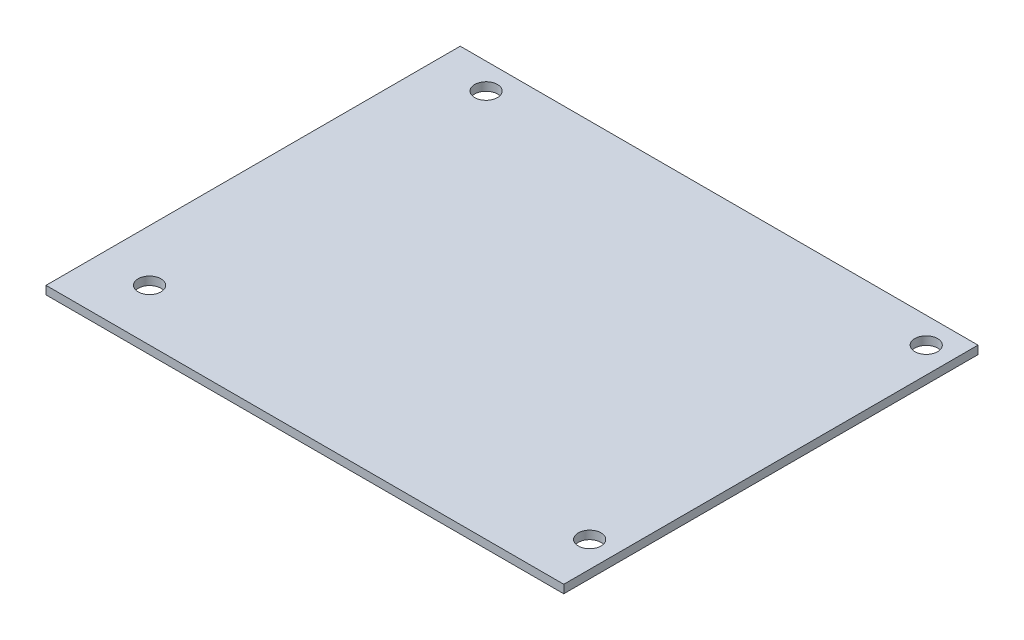
ISO-10303-21;
HEADER;
FILE_DESCRIPTION(('STEP AP214'),'2;1');
FILE_NAME('part.step','',(''),(''),'','','');
FILE_SCHEMA(('AUTOMOTIVE_DESIGN { 1 0 10303 214 1 1 1 1 }'));
ENDSEC;
DATA;
#1=APPLICATION_CONTEXT('core data for automotive mechanical design processes');
#2=APPLICATION_PROTOCOL_DEFINITION('international standard','automotive_design',2000,#1);
#3=PRODUCT_CONTEXT('',#1,'mechanical');
#4=PRODUCT('Part','Part','',(#3));
#5=PRODUCT_RELATED_PRODUCT_CATEGORY('part','',(#4));
#6=PRODUCT_DEFINITION_FORMATION('','',#4);
#7=PRODUCT_DEFINITION_CONTEXT('part definition',#1,'design');
#8=PRODUCT_DEFINITION('design','',#6,#7);
#9=PRODUCT_DEFINITION_SHAPE('','',#8);
#10=(LENGTH_UNIT() NAMED_UNIT(*) SI_UNIT(.MILLI.,.METRE.));
#11=(NAMED_UNIT(*) PLANE_ANGLE_UNIT() SI_UNIT($,.RADIAN.));
#12=(NAMED_UNIT(*) SI_UNIT($,.STERADIAN.) SOLID_ANGLE_UNIT());
#13=UNCERTAINTY_MEASURE_WITH_UNIT(LENGTH_MEASURE(1.E-05),#10,'distance_accuracy_value','');
#14=(GEOMETRIC_REPRESENTATION_CONTEXT(3) GLOBAL_UNCERTAINTY_ASSIGNED_CONTEXT((#13)) GLOBAL_UNIT_ASSIGNED_CONTEXT((#10,
#11,#12)) REPRESENTATION_CONTEXT('',''));
#15=CARTESIAN_POINT('',(0.,0.,0.));
#16=DIRECTION('',(0.,0.,1.));
#17=DIRECTION('',(1.,0.,0.));
#18=AXIS2_PLACEMENT_3D('',#15,#16,#17);
#19=CARTESIAN_POINT('',(50.,1.6,-40.));
#20=DIRECTION('',(-1.,0.,0.));
#21=DIRECTION('',(0.,0.,1.));
#22=AXIS2_PLACEMENT_3D('',#19,#20,#21);
#23=PLANE('',#22);
#24=DIRECTION('',(0.,0.,-1.));
#25=VECTOR('',#24,1.);
#26=CARTESIAN_POINT('',(50.,0.,-40.));
#27=LINE('',#26,#25);
#28=CARTESIAN_POINT('',(50.,0.,40.));
#29=VERTEX_POINT('',#28);
#30=CARTESIAN_POINT('',(50.,0.,-40.));
#31=VERTEX_POINT('',#30);
#32=EDGE_CURVE('E96',#29,#31,#27,.T.);
#33=ORIENTED_EDGE('',*,*,#32,.T.);
#34=DIRECTION('',(0.,-1.,0.));
#35=VECTOR('',#34,1.);
#36=CARTESIAN_POINT('',(50.,1.6,-40.));
#37=LINE('',#36,#35);
#38=CARTESIAN_POINT('',(50.,1.6,-40.));
#39=VERTEX_POINT('',#38);
#40=EDGE_CURVE('E11',#39,#31,#37,.T.);
#41=ORIENTED_EDGE('',*,*,#40,.F.);
#42=DIRECTION('',(0.,0.,-1.));
#43=VECTOR('',#42,1.);
#44=CARTESIAN_POINT('',(50.,1.6,-40.));
#45=LINE('',#44,#43);
#46=CARTESIAN_POINT('',(50.,1.6,40.));
#47=VERTEX_POINT('',#46);
#48=EDGE_CURVE('E84',#47,#39,#45,.T.);
#49=ORIENTED_EDGE('',*,*,#48,.F.);
#50=DIRECTION('',(0.,-1.,0.));
#51=VECTOR('',#50,1.);
#52=CARTESIAN_POINT('',(50.,1.6,40.));
#53=LINE('',#52,#51);
#54=EDGE_CURVE('E92',#47,#29,#53,.T.);
#55=ORIENTED_EDGE('',*,*,#54,.T.);
#56=EDGE_LOOP('',(#33,#41,#49,#55));
#57=FACE_BOUND('',#56,.T.);
#58=ADVANCED_FACE('F33',(#57),#23,.F.);
#59=CARTESIAN_POINT('',(-50.,1.6,-40.));
#60=DIRECTION('',(0.,0.,1.));
#61=DIRECTION('',(1.,0.,0.));
#62=AXIS2_PLACEMENT_3D('',#59,#60,#61);
#63=PLANE('',#62);
#64=DIRECTION('',(-1.,0.,0.));
#65=VECTOR('',#64,1.);
#66=CARTESIAN_POINT('',(-50.,0.,-40.));
#67=LINE('',#66,#65);
#68=CARTESIAN_POINT('',(-50.,0.,-40.));
#69=VERTEX_POINT('',#68);
#70=EDGE_CURVE('E88',#31,#69,#67,.T.);
#71=ORIENTED_EDGE('',*,*,#70,.T.);
#72=DIRECTION('',(0.,-1.,0.));
#73=VECTOR('',#72,1.);
#74=CARTESIAN_POINT('',(-50.,1.6,-40.));
#75=LINE('',#74,#73);
#76=CARTESIAN_POINT('',(-50.,1.6,-40.));
#77=VERTEX_POINT('',#76);
#78=EDGE_CURVE('E41',#77,#69,#75,.T.);
#79=ORIENTED_EDGE('',*,*,#78,.F.);
#80=DIRECTION('',(-1.,0.,0.));
#81=VECTOR('',#80,1.);
#82=CARTESIAN_POINT('',(-50.,1.6,-40.));
#83=LINE('',#82,#81);
#84=EDGE_CURVE('E79',#39,#77,#83,.T.);
#85=ORIENTED_EDGE('',*,*,#84,.F.);
#86=ORIENTED_EDGE('',*,*,#40,.T.);
#87=EDGE_LOOP('',(#71,#79,#85,#86));
#88=FACE_BOUND('',#87,.T.);
#89=ADVANCED_FACE('F87',(#88),#63,.F.);
#90=CARTESIAN_POINT('',(-50.,1.6,-40.));
#91=DIRECTION('',(1.,0.,0.));
#92=DIRECTION('',(0.,0.,-1.));
#93=AXIS2_PLACEMENT_3D('',#90,#91,#92);
#94=PLANE('',#93);
#95=DIRECTION('',(0.,0.,1.));
#96=VECTOR('',#95,1.);
#97=CARTESIAN_POINT('',(-50.,0.,-40.));
#98=LINE('',#97,#96);
#99=CARTESIAN_POINT('',(-50.,0.,40.));
#100=VERTEX_POINT('',#99);
#101=EDGE_CURVE('E66',#69,#100,#98,.T.);
#102=ORIENTED_EDGE('',*,*,#101,.T.);
#103=DIRECTION('',(0.,-1.,0.));
#104=VECTOR('',#103,1.);
#105=CARTESIAN_POINT('',(-50.,1.6,40.));
#106=LINE('',#105,#104);
#107=CARTESIAN_POINT('',(-50.,1.6,40.));
#108=VERTEX_POINT('',#107);
#109=EDGE_CURVE('E89',#108,#100,#106,.T.);
#110=ORIENTED_EDGE('',*,*,#109,.F.);
#111=DIRECTION('',(0.,0.,1.));
#112=VECTOR('',#111,1.);
#113=CARTESIAN_POINT('',(-50.,1.6,-40.));
#114=LINE('',#113,#112);
#115=EDGE_CURVE('E82',#77,#108,#114,.T.);
#116=ORIENTED_EDGE('',*,*,#115,.F.);
#117=ORIENTED_EDGE('',*,*,#78,.T.);
#118=EDGE_LOOP('',(#102,#110,#116,#117));
#119=FACE_BOUND('',#118,.T.);
#120=ADVANCED_FACE('F90',(#119),#94,.F.);
#121=CARTESIAN_POINT('',(-50.,1.6,40.));
#122=DIRECTION('',(0.,0.,-1.));
#123=DIRECTION('',(-1.,0.,0.));
#124=AXIS2_PLACEMENT_3D('',#121,#122,#123);
#125=PLANE('',#124);
#126=DIRECTION('',(1.,0.,0.));
#127=VECTOR('',#126,1.);
#128=CARTESIAN_POINT('',(-50.,0.,40.));
#129=LINE('',#128,#127);
#130=EDGE_CURVE('E72',#100,#29,#129,.T.);
#131=ORIENTED_EDGE('',*,*,#130,.T.);
#132=ORIENTED_EDGE('',*,*,#54,.F.);
#133=DIRECTION('',(1.,0.,0.));
#134=VECTOR('',#133,1.);
#135=CARTESIAN_POINT('',(-50.,1.6,40.));
#136=LINE('',#135,#134);
#137=EDGE_CURVE('E49',#108,#47,#136,.T.);
#138=ORIENTED_EDGE('',*,*,#137,.F.);
#139=ORIENTED_EDGE('',*,*,#109,.T.);
#140=EDGE_LOOP('',(#131,#132,#138,#139));
#141=FACE_BOUND('',#140,.T.);
#142=ADVANCED_FACE('F104',(#141),#125,.F.);
#143=CARTESIAN_POINT('',(0.,1.6,0.));
#144=DIRECTION('',(0.,1.,0.));
#145=DIRECTION('',(0.,0.,1.));
#146=AXIS2_PLACEMENT_3D('',#143,#144,#145);
#147=PLANE('',#146);
#148=CARTESIAN_POINT('',(45.,1.6,30.));
#149=DIRECTION('',(0.,1.,0.));
#150=DIRECTION('',(0.,0.,1.));
#151=AXIS2_PLACEMENT_3D('',#148,#149,#150);
#152=CIRCLE('',#151,2.2);
#153=CARTESIAN_POINT('',(45.,1.6,32.2));
#154=VERTEX_POINT('',#153);
#155=EDGE_CURVE('E128',#154,#154,#152,.T.);
#156=ORIENTED_EDGE('',*,*,#155,.F.);
#157=EDGE_LOOP('',(#156));
#158=FACE_BOUND('',#157,.T.);
#159=CARTESIAN_POINT('',(45.,1.6,-35.));
#160=DIRECTION('',(0.,1.,0.));
#161=DIRECTION('',(0.,0.,1.));
#162=AXIS2_PLACEMENT_3D('',#159,#160,#161);
#163=CIRCLE('',#162,2.2);
#164=CARTESIAN_POINT('',(45.,1.6,-32.8));
#165=VERTEX_POINT('',#164);
#166=EDGE_CURVE('E122',#165,#165,#163,.T.);
#167=ORIENTED_EDGE('',*,*,#166,.F.);
#168=EDGE_LOOP('',(#167));
#169=FACE_BOUND('',#168,.T.);
#170=CARTESIAN_POINT('',(-40.,1.6,-35.));
#171=DIRECTION('',(0.,1.,0.));
#172=DIRECTION('',(0.,0.,1.));
#173=AXIS2_PLACEMENT_3D('',#170,#171,#172);
#174=CIRCLE('',#173,2.2);
#175=CARTESIAN_POINT('',(-40.,1.6,-32.8));
#176=VERTEX_POINT('',#175);
#177=EDGE_CURVE('E116',#176,#176,#174,.T.);
#178=ORIENTED_EDGE('',*,*,#177,.F.);
#179=EDGE_LOOP('',(#178));
#180=FACE_BOUND('',#179,.T.);
#181=CARTESIAN_POINT('',(-40.,1.6,30.));
#182=DIRECTION('',(0.,1.,0.));
#183=DIRECTION('',(0.,0.,1.));
#184=AXIS2_PLACEMENT_3D('',#181,#182,#183);
#185=CIRCLE('',#184,2.2);
#186=CARTESIAN_POINT('',(-40.,1.6,32.2));
#187=VERTEX_POINT('',#186);
#188=EDGE_CURVE('E110',#187,#187,#185,.T.);
#189=ORIENTED_EDGE('',*,*,#188,.F.);
#190=EDGE_LOOP('',(#189));
#191=FACE_BOUND('',#190,.T.);
#192=ORIENTED_EDGE('',*,*,#48,.T.);
#193=ORIENTED_EDGE('',*,*,#84,.T.);
#194=ORIENTED_EDGE('',*,*,#115,.T.);
#195=ORIENTED_EDGE('',*,*,#137,.T.);
#196=EDGE_LOOP('',(#192,#193,#194,#195));
#197=FACE_BOUND('',#196,.T.);
#198=ADVANCED_FACE('F80',(#158,#169,#180,#191,#197),#147,.T.);
#199=CARTESIAN_POINT('',(0.,0.,0.));
#200=DIRECTION('',(0.,1.,0.));
#201=DIRECTION('',(0.,0.,1.));
#202=AXIS2_PLACEMENT_3D('',#199,#200,#201);
#203=PLANE('',#202);
#204=CARTESIAN_POINT('',(45.,0.,30.));
#205=DIRECTION('',(0.,1.,0.));
#206=DIRECTION('',(0.,0.,1.));
#207=AXIS2_PLACEMENT_3D('',#204,#205,#206);
#208=CIRCLE('',#207,2.2);
#209=CARTESIAN_POINT('',(45.,0.,32.2));
#210=VERTEX_POINT('',#209);
#211=EDGE_CURVE('E125',#210,#210,#208,.T.);
#212=ORIENTED_EDGE('',*,*,#211,.T.);
#213=EDGE_LOOP('',(#212));
#214=FACE_BOUND('',#213,.T.);
#215=CARTESIAN_POINT('',(45.,0.,-35.));
#216=DIRECTION('',(0.,1.,0.));
#217=DIRECTION('',(0.,0.,1.));
#218=AXIS2_PLACEMENT_3D('',#215,#216,#217);
#219=CIRCLE('',#218,2.2);
#220=CARTESIAN_POINT('',(45.,0.,-32.8));
#221=VERTEX_POINT('',#220);
#222=EDGE_CURVE('E119',#221,#221,#219,.T.);
#223=ORIENTED_EDGE('',*,*,#222,.T.);
#224=EDGE_LOOP('',(#223));
#225=FACE_BOUND('',#224,.T.);
#226=CARTESIAN_POINT('',(-40.,0.,-35.));
#227=DIRECTION('',(0.,1.,0.));
#228=DIRECTION('',(0.,0.,1.));
#229=AXIS2_PLACEMENT_3D('',#226,#227,#228);
#230=CIRCLE('',#229,2.2);
#231=CARTESIAN_POINT('',(-40.,0.,-32.8));
#232=VERTEX_POINT('',#231);
#233=EDGE_CURVE('E113',#232,#232,#230,.T.);
#234=ORIENTED_EDGE('',*,*,#233,.T.);
#235=EDGE_LOOP('',(#234));
#236=FACE_BOUND('',#235,.T.);
#237=CARTESIAN_POINT('',(-40.,0.,30.));
#238=DIRECTION('',(0.,1.,0.));
#239=DIRECTION('',(0.,0.,1.));
#240=AXIS2_PLACEMENT_3D('',#237,#238,#239);
#241=CIRCLE('',#240,2.2);
#242=CARTESIAN_POINT('',(-40.,0.,32.2));
#243=VERTEX_POINT('',#242);
#244=EDGE_CURVE('E99',#243,#243,#241,.T.);
#245=ORIENTED_EDGE('',*,*,#244,.T.);
#246=EDGE_LOOP('',(#245));
#247=FACE_BOUND('',#246,.T.);
#248=ORIENTED_EDGE('',*,*,#32,.F.);
#249=ORIENTED_EDGE('',*,*,#130,.F.);
#250=ORIENTED_EDGE('',*,*,#101,.F.);
#251=ORIENTED_EDGE('',*,*,#70,.F.);
#252=EDGE_LOOP('',(#248,#249,#250,#251));
#253=FACE_BOUND('',#252,.T.);
#254=ADVANCED_FACE('F107',(#214,#225,#236,#247,#253),#203,.F.);
#255=CARTESIAN_POINT('',(-40.,0.,30.));
#256=DIRECTION('',(0.,1.,0.));
#257=DIRECTION('',(0.,0.,1.));
#258=AXIS2_PLACEMENT_3D('',#255,#256,#257);
#259=CYLINDRICAL_SURFACE('',#258,2.2);
#260=ORIENTED_EDGE('',*,*,#244,.F.);
#261=EDGE_LOOP('',(#260));
#262=FACE_BOUND('',#261,.T.);
#263=ORIENTED_EDGE('',*,*,#188,.T.);
#264=EDGE_LOOP('',(#263));
#265=FACE_BOUND('',#264,.T.);
#266=ADVANCED_FACE('F152',(#262,#265),#259,.F.);
#267=CARTESIAN_POINT('',(-40.,0.,-35.));
#268=DIRECTION('',(0.,1.,0.));
#269=DIRECTION('',(0.,0.,1.));
#270=AXIS2_PLACEMENT_3D('',#267,#268,#269);
#271=CYLINDRICAL_SURFACE('',#270,2.2);
#272=ORIENTED_EDGE('',*,*,#233,.F.);
#273=EDGE_LOOP('',(#272));
#274=FACE_BOUND('',#273,.T.);
#275=ORIENTED_EDGE('',*,*,#177,.T.);
#276=EDGE_LOOP('',(#275));
#277=FACE_BOUND('',#276,.T.);
#278=ADVANCED_FACE('F154',(#274,#277),#271,.F.);
#279=CARTESIAN_POINT('',(45.,0.,-35.));
#280=DIRECTION('',(0.,1.,0.));
#281=DIRECTION('',(0.,0.,1.));
#282=AXIS2_PLACEMENT_3D('',#279,#280,#281);
#283=CYLINDRICAL_SURFACE('',#282,2.2);
#284=ORIENTED_EDGE('',*,*,#222,.F.);
#285=EDGE_LOOP('',(#284));
#286=FACE_BOUND('',#285,.T.);
#287=ORIENTED_EDGE('',*,*,#166,.T.);
#288=EDGE_LOOP('',(#287));
#289=FACE_BOUND('',#288,.T.);
#290=ADVANCED_FACE('F139',(#286,#289),#283,.F.);
#291=CARTESIAN_POINT('',(45.,0.,30.));
#292=DIRECTION('',(0.,1.,0.));
#293=DIRECTION('',(0.,0.,1.));
#294=AXIS2_PLACEMENT_3D('',#291,#292,#293);
#295=CYLINDRICAL_SURFACE('',#294,2.2);
#296=ORIENTED_EDGE('',*,*,#211,.F.);
#297=EDGE_LOOP('',(#296));
#298=FACE_BOUND('',#297,.T.);
#299=ORIENTED_EDGE('',*,*,#155,.T.);
#300=EDGE_LOOP('',(#299));
#301=FACE_BOUND('',#300,.T.);
#302=ADVANCED_FACE('F136',(#298,#301),#295,.F.);
#303=CLOSED_SHELL('',(#58,#89,#120,#142,#198,#254,#266,#278,#290,#302));
#304=MANIFOLD_SOLID_BREP('B2',#303);
#305=ADVANCED_BREP_SHAPE_REPRESENTATION('',(#18,#304),#14);
#306=SHAPE_DEFINITION_REPRESENTATION(#9,#305);
ENDSEC;
END-ISO-10303-21;
